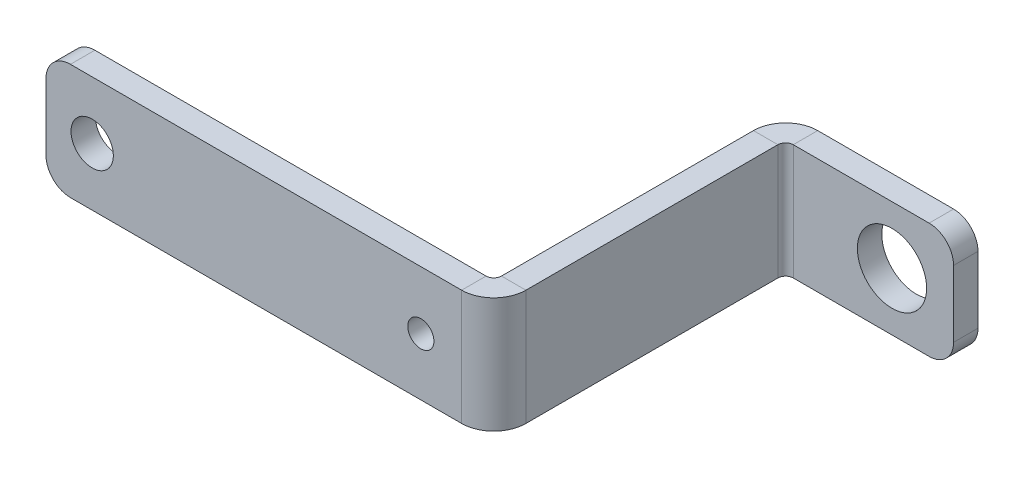
ISO-10303-21;
HEADER;
FILE_DESCRIPTION(('STEP AP214'),'2;1');
FILE_NAME('part.step','',(''),(''),'','','');
FILE_SCHEMA(('AUTOMOTIVE_DESIGN { 1 0 10303 214 1 1 1 1 }'));
ENDSEC;
DATA;
#1=APPLICATION_CONTEXT('core data for automotive mechanical design processes');
#2=APPLICATION_PROTOCOL_DEFINITION('international standard','automotive_design',2000,#1);
#3=PRODUCT_CONTEXT('',#1,'mechanical');
#4=PRODUCT('Part','Part','',(#3));
#5=PRODUCT_RELATED_PRODUCT_CATEGORY('part','',(#4));
#6=PRODUCT_DEFINITION_FORMATION('','',#4);
#7=PRODUCT_DEFINITION_CONTEXT('part definition',#1,'design');
#8=PRODUCT_DEFINITION('design','',#6,#7);
#9=PRODUCT_DEFINITION_SHAPE('','',#8);
#10=(LENGTH_UNIT() NAMED_UNIT(*) SI_UNIT(.MILLI.,.METRE.));
#11=(NAMED_UNIT(*) PLANE_ANGLE_UNIT() SI_UNIT($,.RADIAN.));
#12=(NAMED_UNIT(*) SI_UNIT($,.STERADIAN.) SOLID_ANGLE_UNIT());
#13=UNCERTAINTY_MEASURE_WITH_UNIT(LENGTH_MEASURE(1.E-05),#10,'distance_accuracy_value','');
#14=(GEOMETRIC_REPRESENTATION_CONTEXT(3) GLOBAL_UNCERTAINTY_ASSIGNED_CONTEXT((#13)) GLOBAL_UNIT_ASSIGNED_CONTEXT((#10,
#11,#12)) REPRESENTATION_CONTEXT('',''));
#15=CARTESIAN_POINT('',(0.,0.,0.));
#16=DIRECTION('',(0.,0.,1.));
#17=DIRECTION('',(1.,0.,0.));
#18=AXIS2_PLACEMENT_3D('',#15,#16,#17);
#19=CARTESIAN_POINT('',(73.9092845848611,306.128054741671,3.175));
#20=DIRECTION('',(1.,0.,0.));
#21=DIRECTION('',(0.,0.,-1.));
#22=AXIS2_PLACEMENT_3D('',#19,#20,#21);
#23=PLANE('',#22);
#24=DIRECTION('',(0.,-1.,0.));
#25=VECTOR('',#24,1.);
#26=CARTESIAN_POINT('',(73.9092845848611,306.128054741671,3.175));
#27=LINE('',#26,#25);
#28=CARTESIAN_POINT('',(73.9092845848611,317.953054741671,3.175));
#29=VERTEX_POINT('',#28);
#30=CARTESIAN_POINT('',(73.9092845848611,309.303054741671,3.175));
#31=VERTEX_POINT('',#30);
#32=EDGE_CURVE('E302',#29,#31,#27,.T.);
#33=ORIENTED_EDGE('',*,*,#32,.F.);
#34=DIRECTION('',(0.,0.,-1.));
#35=VECTOR('',#34,1.);
#36=CARTESIAN_POINT('',(73.9092845848611,317.953054741671,3.175));
#37=LINE('',#36,#35);
#38=CARTESIAN_POINT('',(73.9092845848611,317.953054741671,0.));
#39=VERTEX_POINT('',#38);
#40=EDGE_CURVE('E342',#29,#39,#37,.T.);
#41=ORIENTED_EDGE('',*,*,#40,.T.);
#42=DIRECTION('',(0.,-1.,0.));
#43=VECTOR('',#42,1.);
#44=CARTESIAN_POINT('',(73.9092845848611,306.128054741671,0.));
#45=LINE('',#44,#43);
#46=CARTESIAN_POINT('',(73.9092845848611,309.303054741671,0.));
#47=VERTEX_POINT('',#46);
#48=EDGE_CURVE('E291',#39,#47,#45,.T.);
#49=ORIENTED_EDGE('',*,*,#48,.T.);
#50=DIRECTION('',(0.,0.,-1.));
#51=VECTOR('',#50,1.);
#52=CARTESIAN_POINT('',(73.9092845848611,309.303054741671,3.175));
#53=LINE('',#52,#51);
#54=EDGE_CURVE('E340',#47,#31,#53,.F.);
#55=ORIENTED_EDGE('',*,*,#54,.T.);
#56=EDGE_LOOP('',(#33,#41,#49,#55));
#57=FACE_BOUND('',#56,.T.);
#58=ADVANCED_FACE('F81',(#57),#23,.F.);
#59=CARTESIAN_POINT('',(79.9092845848611,306.128054741671,3.175));
#60=DIRECTION('',(0.,1.,0.));
#61=DIRECTION('',(-1.,0.,0.));
#62=AXIS2_PLACEMENT_3D('',#59,#60,#61);
#63=PLANE('',#62);
#64=DIRECTION('',(1.,0.,0.));
#65=VECTOR('',#64,1.);
#66=CARTESIAN_POINT('',(79.9092845848611,306.128054741671,3.175));
#67=LINE('',#66,#65);
#68=CARTESIAN_POINT('',(77.0842845848611,306.128054741671,3.175));
#69=VERTEX_POINT('',#68);
#70=CARTESIAN_POINT('',(127.909284584861,306.128054741671,3.175));
#71=VERTEX_POINT('',#70);
#72=EDGE_CURVE('E305',#69,#71,#67,.T.);
#73=ORIENTED_EDGE('',*,*,#72,.F.);
#74=DIRECTION('',(0.,0.,-1.));
#75=VECTOR('',#74,1.);
#76=CARTESIAN_POINT('',(77.0842845848611,306.128054741671,3.175));
#77=LINE('',#76,#75);
#78=CARTESIAN_POINT('',(77.0842845848611,306.128054741671,0.));
#79=VERTEX_POINT('',#78);
#80=EDGE_CURVE('E13',#69,#79,#77,.T.);
#81=ORIENTED_EDGE('',*,*,#80,.T.);
#82=DIRECTION('',(1.,0.,0.));
#83=VECTOR('',#82,1.);
#84=CARTESIAN_POINT('',(79.9092845848611,306.128054741671,0.));
#85=LINE('',#84,#83);
#86=CARTESIAN_POINT('',(127.909284584861,306.128054741671,0.));
#87=VERTEX_POINT('',#86);
#88=EDGE_CURVE('E313',#79,#87,#85,.T.);
#89=ORIENTED_EDGE('',*,*,#88,.T.);
#90=DIRECTION('',(0.,0.,-1.));
#91=VECTOR('',#90,1.);
#92=CARTESIAN_POINT('',(127.909284584861,306.128054741671,3.175));
#93=LINE('',#92,#91);
#94=EDGE_CURVE('E320',#71,#87,#93,.T.);
#95=ORIENTED_EDGE('',*,*,#94,.F.);
#96=EDGE_LOOP('',(#73,#81,#89,#95));
#97=FACE_BOUND('',#96,.T.);
#98=ADVANCED_FACE('F433',(#97),#63,.F.);
#99=CARTESIAN_POINT('',(127.909284584861,321.128054741671,3.175));
#100=DIRECTION('',(0.,-1.,0.));
#101=DIRECTION('',(0.,0.,-1.));
#102=AXIS2_PLACEMENT_3D('',#99,#100,#101);
#103=PLANE('',#102);
#104=DIRECTION('',(-1.,0.,0.));
#105=VECTOR('',#104,1.);
#106=CARTESIAN_POINT('',(127.909284584861,321.128054741671,0.));
#107=LINE('',#106,#105);
#108=CARTESIAN_POINT('',(127.909284584861,321.12805474167,0.));
#109=VERTEX_POINT('',#108);
#110=CARTESIAN_POINT('',(77.0842845848611,321.128054741671,0.));
#111=VERTEX_POINT('',#110);
#112=EDGE_CURVE('E303',#109,#111,#107,.T.);
#113=ORIENTED_EDGE('',*,*,#112,.T.);
#114=DIRECTION('',(0.,0.,-1.));
#115=VECTOR('',#114,1.);
#116=CARTESIAN_POINT('',(77.0842845848611,321.128054741671,3.175));
#117=LINE('',#116,#115);
#118=CARTESIAN_POINT('',(77.0842845848611,321.128054741671,3.175));
#119=VERTEX_POINT('',#118);
#120=EDGE_CURVE('E105',#111,#119,#117,.F.);
#121=ORIENTED_EDGE('',*,*,#120,.T.);
#122=DIRECTION('',(-1.,0.,0.));
#123=VECTOR('',#122,1.);
#124=CARTESIAN_POINT('',(73.9092845848611,321.128054741671,3.175));
#125=LINE('',#124,#123);
#126=CARTESIAN_POINT('',(127.909284584861,321.128054741671,3.175));
#127=VERTEX_POINT('',#126);
#128=EDGE_CURVE('E300',#127,#119,#125,.T.);
#129=ORIENTED_EDGE('',*,*,#128,.F.);
#130=DIRECTION('',(0.,0.,-1.));
#131=VECTOR('',#130,1.);
#132=CARTESIAN_POINT('',(127.909284584861,321.128054741671,3.175));
#133=LINE('',#132,#131);
#134=EDGE_CURVE('E310',#127,#109,#133,.T.);
#135=ORIENTED_EDGE('',*,*,#134,.T.);
#136=EDGE_LOOP('',(#113,#121,#129,#135));
#137=FACE_BOUND('',#136,.T.);
#138=ADVANCED_FACE('F364',(#137),#103,.F.);
#139=CARTESIAN_POINT('',(0.,0.,3.175));
#140=DIRECTION('',(0.,0.,1.));
#141=DIRECTION('',(1.,0.,0.));
#142=AXIS2_PLACEMENT_3D('',#139,#140,#141);
#143=PLANE('',#142);
#144=CARTESIAN_POINT('',(122.60928458487,313.578054741671,3.175));
#145=DIRECTION('',(0.,0.,1.));
#146=DIRECTION('',(1.,0.,0.));
#147=AXIS2_PLACEMENT_3D('',#144,#145,#146);
#148=CIRCLE('',#147,1.69999999999999);
#149=CARTESIAN_POINT('',(124.30928458487,313.578054741671,3.175));
#150=VERTEX_POINT('',#149);
#151=EDGE_CURVE('E414',#150,#150,#148,.T.);
#152=ORIENTED_EDGE('',*,*,#151,.F.);
#153=EDGE_LOOP('',(#152));
#154=FACE_BOUND('',#153,.T.);
#155=CARTESIAN_POINT('',(79.9092845848612,313.628054741671,3.175));
#156=DIRECTION('',(0.,0.,1.));
#157=DIRECTION('',(1.,0.,0.));
#158=AXIS2_PLACEMENT_3D('',#155,#156,#157);
#159=CIRCLE('',#158,2.75);
#160=CARTESIAN_POINT('',(82.6592845848612,313.628054741671,3.175));
#161=VERTEX_POINT('',#160);
#162=EDGE_CURVE('E405',#161,#161,#159,.T.);
#163=ORIENTED_EDGE('',*,*,#162,.F.);
#164=EDGE_LOOP('',(#163));
#165=FACE_BOUND('',#164,.T.);
#166=ORIENTED_EDGE('',*,*,#128,.T.);
#167=CARTESIAN_POINT('',(77.0842845848611,317.953054741671,3.175));
#168=DIRECTION('',(0.,0.,1.));
#169=DIRECTION('',(1.,0.,0.));
#170=AXIS2_PLACEMENT_3D('',#167,#168,#169);
#171=CIRCLE('',#170,3.175);
#172=EDGE_CURVE('E90',#119,#29,#171,.T.);
#173=ORIENTED_EDGE('',*,*,#172,.T.);
#174=ORIENTED_EDGE('',*,*,#32,.T.);
#175=CARTESIAN_POINT('',(77.0842845848611,309.303054741671,3.175));
#176=DIRECTION('',(0.,0.,1.));
#177=DIRECTION('',(1.,0.,0.));
#178=AXIS2_PLACEMENT_3D('',#175,#176,#177);
#179=CIRCLE('',#178,3.175);
#180=EDGE_CURVE('E97',#31,#69,#179,.T.);
#181=ORIENTED_EDGE('',*,*,#180,.T.);
#182=ORIENTED_EDGE('',*,*,#72,.T.);
#183=DIRECTION('',(0.,1.,0.));
#184=VECTOR('',#183,1.);
#185=CARTESIAN_POINT('',(127.909284584861,306.128054741671,3.175));
#186=LINE('',#185,#184);
#187=EDGE_CURVE('E307',#71,#127,#186,.T.);
#188=ORIENTED_EDGE('',*,*,#187,.T.);
#189=EDGE_LOOP('',(#166,#173,#174,#181,#182,#188));
#190=FACE_BOUND('',#189,.T.);
#191=ADVANCED_FACE('F353',(#154,#165,#190),#143,.T.);
#192=CARTESIAN_POINT('',(0.,0.,0.));
#193=DIRECTION('',(0.,0.,1.));
#194=DIRECTION('',(1.,0.,0.));
#195=AXIS2_PLACEMENT_3D('',#192,#193,#194);
#196=PLANE('',#195);
#197=CARTESIAN_POINT('',(122.60928458487,313.578054741671,0.));
#198=DIRECTION('',(0.,0.,1.));
#199=DIRECTION('',(1.,0.,0.));
#200=AXIS2_PLACEMENT_3D('',#197,#198,#199);
#201=CIRCLE('',#200,1.69999999999999);
#202=CARTESIAN_POINT('',(124.30928458487,313.578054741671,0.));
#203=VERTEX_POINT('',#202);
#204=EDGE_CURVE('E85',#203,#203,#201,.T.);
#205=ORIENTED_EDGE('',*,*,#204,.T.);
#206=EDGE_LOOP('',(#205));
#207=FACE_BOUND('',#206,.T.);
#208=CARTESIAN_POINT('',(79.9092845848612,313.628054741671,0.));
#209=DIRECTION('',(0.,0.,1.));
#210=DIRECTION('',(1.,0.,0.));
#211=AXIS2_PLACEMENT_3D('',#208,#209,#210);
#212=CIRCLE('',#211,2.75);
#213=CARTESIAN_POINT('',(82.6592845848612,313.628054741671,0.));
#214=VERTEX_POINT('',#213);
#215=EDGE_CURVE('E253',#214,#214,#212,.T.);
#216=ORIENTED_EDGE('',*,*,#215,.T.);
#217=EDGE_LOOP('',(#216));
#218=FACE_BOUND('',#217,.T.);
#219=ORIENTED_EDGE('',*,*,#48,.F.);
#220=CARTESIAN_POINT('',(77.0842845848611,317.953054741671,0.));
#221=DIRECTION('',(0.,0.,1.));
#222=DIRECTION('',(1.,0.,0.));
#223=AXIS2_PLACEMENT_3D('',#220,#221,#222);
#224=CIRCLE('',#223,3.175);
#225=EDGE_CURVE('E347',#39,#111,#224,.F.);
#226=ORIENTED_EDGE('',*,*,#225,.T.);
#227=ORIENTED_EDGE('',*,*,#112,.F.);
#228=DIRECTION('',(0.,1.,0.));
#229=VECTOR('',#228,1.);
#230=CARTESIAN_POINT('',(127.909284584861,306.128054741671,0.));
#231=LINE('',#230,#229);
#232=EDGE_CURVE('E315',#87,#109,#231,.T.);
#233=ORIENTED_EDGE('',*,*,#232,.F.);
#234=ORIENTED_EDGE('',*,*,#88,.F.);
#235=CARTESIAN_POINT('',(77.0842845848611,309.303054741671,0.));
#236=DIRECTION('',(0.,0.,1.));
#237=DIRECTION('',(1.,0.,0.));
#238=AXIS2_PLACEMENT_3D('',#235,#236,#237);
#239=CIRCLE('',#238,3.175);
#240=EDGE_CURVE('E345',#79,#47,#239,.F.);
#241=ORIENTED_EDGE('',*,*,#240,.T.);
#242=EDGE_LOOP('',(#219,#226,#227,#233,#234,#241));
#243=FACE_BOUND('',#242,.T.);
#244=ADVANCED_FACE('F362',(#207,#218,#243),#196,.F.);
#245=CARTESIAN_POINT('',(127.909284584861,321.12805474167,-1.));
#246=DIRECTION('',(0.,1.,0.));
#247=DIRECTION('',(0.,0.,1.));
#248=AXIS2_PLACEMENT_3D('',#245,#246,#247);
#249=PLANE('',#248);
#250=DIRECTION('',(-1.,0.,0.));
#251=VECTOR('',#250,1.);
#252=CARTESIAN_POINT('',(132.084284584861,321.128054741671,-0.99999999999999));
#253=LINE('',#252,#251);
#254=CARTESIAN_POINT('',(128.909284584861,321.12805474167,-1.));
#255=VERTEX_POINT('',#254);
#256=CARTESIAN_POINT('',(132.084284584861,321.12805474167,-0.999999999999991));
#257=VERTEX_POINT('',#256);
#258=EDGE_CURVE('E254',#255,#257,#253,.F.);
#259=ORIENTED_EDGE('',*,*,#258,.F.);
#260=CARTESIAN_POINT('',(127.909284584861,321.12805474167,-1.));
#261=DIRECTION('',(0.,-1.,0.));
#262=DIRECTION('',(0.,0.,-1.));
#263=AXIS2_PLACEMENT_3D('',#260,#261,#262);
#264=CIRCLE('',#263,1.);
#265=EDGE_CURVE('E295',#109,#255,#264,.F.);
#266=ORIENTED_EDGE('',*,*,#265,.F.);
#267=ORIENTED_EDGE('',*,*,#134,.F.);
#268=CARTESIAN_POINT('',(127.909284584861,321.12805474167,-1.));
#269=DIRECTION('',(0.,-1.,0.));
#270=DIRECTION('',(0.,0.,-1.));
#271=AXIS2_PLACEMENT_3D('',#268,#269,#270);
#272=CIRCLE('',#271,4.175);
#273=EDGE_CURVE('E288',#127,#257,#272,.F.);
#274=ORIENTED_EDGE('',*,*,#273,.T.);
#275=EDGE_LOOP('',(#259,#266,#267,#274));
#276=FACE_BOUND('',#275,.T.);
#277=ADVANCED_FACE('F368',(#276),#249,.T.);
#278=CARTESIAN_POINT('',(127.909284584861,306.128054741671,-1.));
#279=DIRECTION('',(0.,1.,0.));
#280=DIRECTION('',(0.,0.,1.));
#281=AXIS2_PLACEMENT_3D('',#278,#279,#280);
#282=PLANE('',#281);
#283=CARTESIAN_POINT('',(127.909284584861,306.128054741671,-1.));
#284=DIRECTION('',(0.,-1.,0.));
#285=DIRECTION('',(0.,0.,-1.));
#286=AXIS2_PLACEMENT_3D('',#283,#284,#285);
#287=CIRCLE('',#286,1.);
#288=CARTESIAN_POINT('',(128.909284584861,306.128054741671,-1.));
#289=VERTEX_POINT('',#288);
#290=EDGE_CURVE('E262',#289,#87,#287,.T.);
#291=ORIENTED_EDGE('',*,*,#290,.F.);
#292=DIRECTION('',(-1.,0.,0.));
#293=VECTOR('',#292,1.);
#294=CARTESIAN_POINT('',(128.909284584861,306.128054741671,-1.));
#295=LINE('',#294,#293);
#296=CARTESIAN_POINT('',(132.084284584861,306.128054741671,-0.99999999999999));
#297=VERTEX_POINT('',#296);
#298=EDGE_CURVE('E281',#289,#297,#295,.F.);
#299=ORIENTED_EDGE('',*,*,#298,.T.);
#300=CARTESIAN_POINT('',(127.909284584861,306.128054741671,-1.));
#301=DIRECTION('',(0.,-1.,0.));
#302=DIRECTION('',(0.,0.,-1.));
#303=AXIS2_PLACEMENT_3D('',#300,#301,#302);
#304=CIRCLE('',#303,4.175);
#305=EDGE_CURVE('E292',#297,#71,#304,.T.);
#306=ORIENTED_EDGE('',*,*,#305,.T.);
#307=ORIENTED_EDGE('',*,*,#94,.T.);
#308=EDGE_LOOP('',(#291,#299,#306,#307));
#309=FACE_BOUND('',#308,.T.);
#310=ADVANCED_FACE('F483',(#309),#282,.F.);
#311=CARTESIAN_POINT('',(127.909284584861,306.128054741671,-1.));
#312=DIRECTION('',(0.,-1.,0.));
#313=DIRECTION('',(1.,0.,0.));
#314=AXIS2_PLACEMENT_3D('',#311,#312,#313);
#315=CYLINDRICAL_SURFACE('',#314,4.175);
#316=ORIENTED_EDGE('',*,*,#187,.F.);
#317=ORIENTED_EDGE('',*,*,#305,.F.);
#318=DIRECTION('',(0.,-1.,0.));
#319=VECTOR('',#318,1.);
#320=CARTESIAN_POINT('',(132.084284584861,321.128054741671,-0.99999999999999));
#321=LINE('',#320,#319);
#322=EDGE_CURVE('E279',#297,#257,#321,.F.);
#323=ORIENTED_EDGE('',*,*,#322,.T.);
#324=ORIENTED_EDGE('',*,*,#273,.F.);
#325=EDGE_LOOP('',(#316,#317,#323,#324));
#326=FACE_BOUND('',#325,.T.);
#327=ADVANCED_FACE('F493',(#326),#315,.T.);
#328=CARTESIAN_POINT('',(127.909284584861,306.128054741671,-1.));
#329=DIRECTION('',(0.,-1.,0.));
#330=DIRECTION('',(1.,0.,0.));
#331=AXIS2_PLACEMENT_3D('',#328,#329,#330);
#332=CYLINDRICAL_SURFACE('',#331,1.);
#333=ORIENTED_EDGE('',*,*,#232,.T.);
#334=ORIENTED_EDGE('',*,*,#265,.T.);
#335=DIRECTION('',(0.,-1.,0.));
#336=VECTOR('',#335,1.);
#337=CARTESIAN_POINT('',(128.909284584861,321.128054741671,-1.));
#338=LINE('',#337,#336);
#339=EDGE_CURVE('E284',#255,#289,#338,.T.);
#340=ORIENTED_EDGE('',*,*,#339,.T.);
#341=ORIENTED_EDGE('',*,*,#290,.T.);
#342=EDGE_LOOP('',(#333,#334,#340,#341));
#343=FACE_BOUND('',#342,.T.);
#344=ADVANCED_FACE('F371',(#343),#332,.F.);
#345=CARTESIAN_POINT('',(132.084284584861,306.128054741671,-33.738));
#346=DIRECTION('',(0.,1.,0.));
#347=DIRECTION('',(0.,0.,1.));
#348=AXIS2_PLACEMENT_3D('',#345,#346,#347);
#349=PLANE('',#348);
#350=ORIENTED_EDGE('',*,*,#298,.F.);
#351=DIRECTION('',(0.,0.,1.));
#352=VECTOR('',#351,1.);
#353=CARTESIAN_POINT('',(128.909284584861,306.128054741671,-33.738));
#354=LINE('',#353,#352);
#355=CARTESIAN_POINT('',(128.909284584861,306.128054741671,-33.738));
#356=VERTEX_POINT('',#355);
#357=EDGE_CURVE('E277',#289,#356,#354,.F.);
#358=ORIENTED_EDGE('',*,*,#357,.T.);
#359=DIRECTION('',(-1.,0.,0.));
#360=VECTOR('',#359,1.);
#361=CARTESIAN_POINT('',(132.084284584861,306.128054741671,-33.738));
#362=LINE('',#361,#360);
#363=CARTESIAN_POINT('',(132.084284584861,306.128054741671,-33.738));
#364=VERTEX_POINT('',#363);
#365=EDGE_CURVE('E259',#364,#356,#362,.T.);
#366=ORIENTED_EDGE('',*,*,#365,.F.);
#367=DIRECTION('',(0.,0.,-1.));
#368=VECTOR('',#367,1.);
#369=CARTESIAN_POINT('',(132.084284584861,306.128054741671,4.31999060487309E-13));
#370=LINE('',#369,#368);
#371=EDGE_CURVE('E271',#297,#364,#370,.T.);
#372=ORIENTED_EDGE('',*,*,#371,.F.);
#373=EDGE_LOOP('',(#350,#358,#366,#372));
#374=FACE_BOUND('',#373,.T.);
#375=ADVANCED_FACE('F514',(#374),#349,.F.);
#376=CARTESIAN_POINT('',(132.084284584861,321.128054741671,0.));
#377=DIRECTION('',(0.,-1.,0.));
#378=DIRECTION('',(0.,0.,-1.));
#379=AXIS2_PLACEMENT_3D('',#376,#377,#378);
#380=PLANE('',#379);
#381=ORIENTED_EDGE('',*,*,#258,.T.);
#382=DIRECTION('',(0.,0.,1.));
#383=VECTOR('',#382,1.);
#384=CARTESIAN_POINT('',(132.084284584861,321.128054741671,4.31999060487309E-13));
#385=LINE('',#384,#383);
#386=CARTESIAN_POINT('',(132.084284584861,321.128054741671,-33.738));
#387=VERTEX_POINT('',#386);
#388=EDGE_CURVE('E266',#387,#257,#385,.T.);
#389=ORIENTED_EDGE('',*,*,#388,.F.);
#390=DIRECTION('',(-1.,0.,0.));
#391=VECTOR('',#390,1.);
#392=CARTESIAN_POINT('',(132.084284584861,321.128054741671,-33.738));
#393=LINE('',#392,#391);
#394=CARTESIAN_POINT('',(128.909284584861,321.128054741671,-33.738));
#395=VERTEX_POINT('',#394);
#396=EDGE_CURVE('E263',#387,#395,#393,.T.);
#397=ORIENTED_EDGE('',*,*,#396,.T.);
#398=DIRECTION('',(0.,0.,-1.));
#399=VECTOR('',#398,1.);
#400=CARTESIAN_POINT('',(128.909284584861,321.128054741671,0.));
#401=LINE('',#400,#399);
#402=EDGE_CURVE('E273',#395,#255,#401,.F.);
#403=ORIENTED_EDGE('',*,*,#402,.T.);
#404=EDGE_LOOP('',(#381,#389,#397,#403));
#405=FACE_BOUND('',#404,.T.);
#406=ADVANCED_FACE('F377',(#405),#380,.F.);
#407=CARTESIAN_POINT('',(132.084284584861,0.,4.31999060487309E-13));
#408=DIRECTION('',(-1.,0.,0.));
#409=DIRECTION('',(0.,0.,1.));
#410=AXIS2_PLACEMENT_3D('',#407,#408,#409);
#411=PLANE('',#410);
#412=ORIENTED_EDGE('',*,*,#322,.F.);
#413=ORIENTED_EDGE('',*,*,#371,.T.);
#414=DIRECTION('',(0.,1.,0.));
#415=VECTOR('',#414,1.);
#416=CARTESIAN_POINT('',(132.084284584861,0.,-33.738));
#417=LINE('',#416,#415);
#418=EDGE_CURVE('E269',#364,#387,#417,.T.);
#419=ORIENTED_EDGE('',*,*,#418,.T.);
#420=ORIENTED_EDGE('',*,*,#388,.T.);
#421=EDGE_LOOP('',(#412,#413,#419,#420));
#422=FACE_BOUND('',#421,.T.);
#423=ADVANCED_FACE('F534',(#422),#411,.F.);
#424=CARTESIAN_POINT('',(128.909284584861,0.,4.20913607236482E-13));
#425=DIRECTION('',(-1.,0.,0.));
#426=DIRECTION('',(0.,0.,1.));
#427=AXIS2_PLACEMENT_3D('',#424,#425,#426);
#428=PLANE('',#427);
#429=ORIENTED_EDGE('',*,*,#357,.F.);
#430=ORIENTED_EDGE('',*,*,#339,.F.);
#431=ORIENTED_EDGE('',*,*,#402,.F.);
#432=DIRECTION('',(0.,-1.,0.));
#433=VECTOR('',#432,1.);
#434=CARTESIAN_POINT('',(128.909284584861,321.128054741671,-33.738));
#435=LINE('',#434,#433);
#436=EDGE_CURVE('E207',#356,#395,#435,.F.);
#437=ORIENTED_EDGE('',*,*,#436,.F.);
#438=EDGE_LOOP('',(#429,#430,#431,#437));
#439=FACE_BOUND('',#438,.T.);
#440=ADVANCED_FACE('F375',(#439),#428,.T.);
#441=CARTESIAN_POINT('',(133.084284584861,306.128054741671,-33.738));
#442=DIRECTION('',(0.,-1.,0.));
#443=DIRECTION('',(0.,0.,-1.));
#444=AXIS2_PLACEMENT_3D('',#441,#442,#443);
#445=PLANE('',#444);
#446=DIRECTION('',(0.,0.,1.));
#447=VECTOR('',#446,1.);
#448=CARTESIAN_POINT('',(133.084284584861,306.128054741671,-37.913));
#449=LINE('',#448,#447);
#450=CARTESIAN_POINT('',(133.084284584861,306.128054741671,-34.738));
#451=VERTEX_POINT('',#450);
#452=CARTESIAN_POINT('',(133.084284584861,306.128054741671,-37.913));
#453=VERTEX_POINT('',#452);
#454=EDGE_CURVE('E250',#451,#453,#449,.F.);
#455=ORIENTED_EDGE('',*,*,#454,.F.);
#456=CARTESIAN_POINT('',(133.084284584861,306.128054741671,-33.738));
#457=DIRECTION('',(0.,1.,0.));
#458=DIRECTION('',(0.,0.,1.));
#459=AXIS2_PLACEMENT_3D('',#456,#457,#458);
#460=CIRCLE('',#459,1.);
#461=EDGE_CURVE('E211',#364,#451,#460,.F.);
#462=ORIENTED_EDGE('',*,*,#461,.F.);
#463=ORIENTED_EDGE('',*,*,#365,.T.);
#464=CARTESIAN_POINT('',(133.084284584861,306.128054741671,-33.738));
#465=DIRECTION('',(0.,1.,0.));
#466=DIRECTION('',(0.,0.,1.));
#467=AXIS2_PLACEMENT_3D('',#464,#465,#466);
#468=CIRCLE('',#467,4.175);
#469=EDGE_CURVE('E210',#356,#453,#468,.F.);
#470=ORIENTED_EDGE('',*,*,#469,.T.);
#471=EDGE_LOOP('',(#455,#462,#463,#470));
#472=FACE_BOUND('',#471,.T.);
#473=ADVANCED_FACE('F554',(#472),#445,.T.);
#474=CARTESIAN_POINT('',(133.084284584861,321.128054741671,-33.738));
#475=DIRECTION('',(0.,-1.,0.));
#476=DIRECTION('',(0.,0.,-1.));
#477=AXIS2_PLACEMENT_3D('',#474,#475,#476);
#478=PLANE('',#477);
#479=CARTESIAN_POINT('',(133.084284584861,321.128054741671,-33.738));
#480=DIRECTION('',(0.,1.,0.));
#481=DIRECTION('',(0.,0.,1.));
#482=AXIS2_PLACEMENT_3D('',#479,#480,#481);
#483=CIRCLE('',#482,1.);
#484=CARTESIAN_POINT('',(133.084284584861,321.128054741671,-34.738));
#485=VERTEX_POINT('',#484);
#486=EDGE_CURVE('E218',#485,#387,#483,.T.);
#487=ORIENTED_EDGE('',*,*,#486,.F.);
#488=DIRECTION('',(0.,0.,1.));
#489=VECTOR('',#488,1.);
#490=CARTESIAN_POINT('',(133.084284584861,321.128054741671,-34.738));
#491=LINE('',#490,#489);
#492=CARTESIAN_POINT('',(133.084284584861,321.128054741671,-37.913));
#493=VERTEX_POINT('',#492);
#494=EDGE_CURVE('E215',#485,#493,#491,.F.);
#495=ORIENTED_EDGE('',*,*,#494,.T.);
#496=CARTESIAN_POINT('',(133.084284584861,321.128054741671,-33.738));
#497=DIRECTION('',(0.,1.,0.));
#498=DIRECTION('',(0.,0.,1.));
#499=AXIS2_PLACEMENT_3D('',#496,#497,#498);
#500=CIRCLE('',#499,4.175);
#501=EDGE_CURVE('E199',#493,#395,#500,.T.);
#502=ORIENTED_EDGE('',*,*,#501,.T.);
#503=ORIENTED_EDGE('',*,*,#396,.F.);
#504=EDGE_LOOP('',(#487,#495,#502,#503));
#505=FACE_BOUND('',#504,.T.);
#506=ADVANCED_FACE('F216',(#505),#478,.F.);
#507=CARTESIAN_POINT('',(133.084284584861,321.128054741671,-33.738));
#508=DIRECTION('',(0.,1.,0.));
#509=DIRECTION('',(0.,0.,-1.));
#510=AXIS2_PLACEMENT_3D('',#507,#508,#509);
#511=CYLINDRICAL_SURFACE('',#510,4.175);
#512=ORIENTED_EDGE('',*,*,#436,.T.);
#513=ORIENTED_EDGE('',*,*,#501,.F.);
#514=DIRECTION('',(0.,1.,0.));
#515=VECTOR('',#514,1.);
#516=CARTESIAN_POINT('',(133.084284584861,306.128054741671,-37.913));
#517=LINE('',#516,#515);
#518=EDGE_CURVE('E204',#493,#453,#517,.F.);
#519=ORIENTED_EDGE('',*,*,#518,.T.);
#520=ORIENTED_EDGE('',*,*,#469,.F.);
#521=EDGE_LOOP('',(#512,#513,#519,#520));
#522=FACE_BOUND('',#521,.T.);
#523=ADVANCED_FACE('F201',(#522),#511,.T.);
#524=CARTESIAN_POINT('',(133.084284584861,321.128054741671,-33.738));
#525=DIRECTION('',(0.,1.,0.));
#526=DIRECTION('',(0.,0.,-1.));
#527=AXIS2_PLACEMENT_3D('',#524,#525,#526);
#528=CYLINDRICAL_SURFACE('',#527,1.);
#529=ORIENTED_EDGE('',*,*,#418,.F.);
#530=ORIENTED_EDGE('',*,*,#461,.T.);
#531=DIRECTION('',(0.,1.,0.));
#532=VECTOR('',#531,1.);
#533=CARTESIAN_POINT('',(133.084284584861,306.128054741671,-34.738));
#534=LINE('',#533,#532);
#535=EDGE_CURVE('E223',#451,#485,#534,.T.);
#536=ORIENTED_EDGE('',*,*,#535,.T.);
#537=ORIENTED_EDGE('',*,*,#486,.T.);
#538=EDGE_LOOP('',(#529,#530,#536,#537));
#539=FACE_BOUND('',#538,.T.);
#540=ADVANCED_FACE('F381',(#539),#528,.F.);
#541=CARTESIAN_POINT('',(153.909284584861,321.128054741671,-37.913));
#542=DIRECTION('',(0.,-1.,0.));
#543=DIRECTION('',(0.,0.,-1.));
#544=AXIS2_PLACEMENT_3D('',#541,#542,#543);
#545=PLANE('',#544);
#546=DIRECTION('',(-1.,0.,0.));
#547=VECTOR('',#546,1.);
#548=CARTESIAN_POINT('',(153.909284584861,321.128054741671,-34.738));
#549=LINE('',#548,#547);
#550=CARTESIAN_POINT('',(150.734284584861,321.128054741671,-34.738));
#551=VERTEX_POINT('',#550);
#552=EDGE_CURVE('E232',#485,#551,#549,.F.);
#553=ORIENTED_EDGE('',*,*,#552,.T.);
#554=DIRECTION('',(0.,0.,1.));
#555=VECTOR('',#554,1.);
#556=CARTESIAN_POINT('',(150.734284584861,321.128054741671,-37.913));
#557=LINE('',#556,#555);
#558=CARTESIAN_POINT('',(150.734284584861,321.128054741671,-37.913));
#559=VERTEX_POINT('',#558);
#560=EDGE_CURVE('E236',#551,#559,#557,.F.);
#561=ORIENTED_EDGE('',*,*,#560,.T.);
#562=DIRECTION('',(1.,0.,0.));
#563=VECTOR('',#562,1.);
#564=CARTESIAN_POINT('',(0.,321.128054741671,-37.9129999999999));
#565=LINE('',#564,#563);
#566=EDGE_CURVE('E228',#493,#559,#565,.T.);
#567=ORIENTED_EDGE('',*,*,#566,.F.);
#568=ORIENTED_EDGE('',*,*,#494,.F.);
#569=EDGE_LOOP('',(#553,#561,#567,#568));
#570=FACE_BOUND('',#569,.T.);
#571=ADVANCED_FACE('F234',(#570),#545,.F.);
#572=CARTESIAN_POINT('',(132.084284584861,306.128054741671,-37.913));
#573=DIRECTION('',(0.,1.,0.));
#574=DIRECTION('',(0.,0.,1.));
#575=AXIS2_PLACEMENT_3D('',#572,#573,#574);
#576=PLANE('',#575);
#577=DIRECTION('',(-1.,0.,0.));
#578=VECTOR('',#577,1.);
#579=CARTESIAN_POINT('',(0.,306.128054741671,-37.9129999999999));
#580=LINE('',#579,#578);
#581=CARTESIAN_POINT('',(150.734284584861,306.128054741671,-37.913));
#582=VERTEX_POINT('',#581);
#583=EDGE_CURVE('E231',#582,#453,#580,.T.);
#584=ORIENTED_EDGE('',*,*,#583,.F.);
#585=DIRECTION('',(0.,0.,1.));
#586=VECTOR('',#585,1.);
#587=CARTESIAN_POINT('',(150.734284584861,306.128054741671,-37.913));
#588=LINE('',#587,#586);
#589=CARTESIAN_POINT('',(150.734284584861,306.128054741671,-34.738));
#590=VERTEX_POINT('',#589);
#591=EDGE_CURVE('E337',#582,#590,#588,.T.);
#592=ORIENTED_EDGE('',*,*,#591,.T.);
#593=DIRECTION('',(1.,0.,0.));
#594=VECTOR('',#593,1.);
#595=CARTESIAN_POINT('',(132.084284584861,306.128054741671,-34.738));
#596=LINE('',#595,#594);
#597=EDGE_CURVE('E238',#590,#451,#596,.F.);
#598=ORIENTED_EDGE('',*,*,#597,.T.);
#599=ORIENTED_EDGE('',*,*,#454,.T.);
#600=EDGE_LOOP('',(#584,#592,#598,#599));
#601=FACE_BOUND('',#600,.T.);
#602=ADVANCED_FACE('F400',(#601),#576,.F.);
#603=CARTESIAN_POINT('',(0.,0.,-37.9129999999999));
#604=DIRECTION('',(0.,0.,1.));
#605=DIRECTION('',(1.,0.,0.));
#606=AXIS2_PLACEMENT_3D('',#603,#604,#605);
#607=PLANE('',#606);
#608=CARTESIAN_POINT('',(145.909284584861,313.628054741671,-37.913));
#609=DIRECTION('',(0.,0.,1.));
#610=DIRECTION('',(1.,0.,0.));
#611=AXIS2_PLACEMENT_3D('',#608,#609,#610);
#612=CIRCLE('',#611,4.5);
#613=CARTESIAN_POINT('',(150.409284584861,313.628054741671,-37.913));
#614=VERTEX_POINT('',#613);
#615=EDGE_CURVE('E408',#614,#614,#612,.T.);
#616=ORIENTED_EDGE('',*,*,#615,.T.);
#617=EDGE_LOOP('',(#616));
#618=FACE_BOUND('',#617,.T.);
#619=ORIENTED_EDGE('',*,*,#566,.T.);
#620=CARTESIAN_POINT('',(150.734284584861,317.953054741671,-37.913));
#621=DIRECTION('',(0.,0.,1.));
#622=DIRECTION('',(1.,0.,0.));
#623=AXIS2_PLACEMENT_3D('',#620,#621,#622);
#624=CIRCLE('',#623,3.175);
#625=CARTESIAN_POINT('',(153.909284584861,317.953054741671,-37.913));
#626=VERTEX_POINT('',#625);
#627=EDGE_CURVE('E335',#559,#626,#624,.F.);
#628=ORIENTED_EDGE('',*,*,#627,.T.);
#629=DIRECTION('',(0.,-1.,0.));
#630=VECTOR('',#629,1.);
#631=CARTESIAN_POINT('',(153.909284584861,0.,-37.913));
#632=LINE('',#631,#630);
#633=CARTESIAN_POINT('',(153.909284584861,309.303054741671,-37.913));
#634=VERTEX_POINT('',#633);
#635=EDGE_CURVE('E237',#626,#634,#632,.T.);
#636=ORIENTED_EDGE('',*,*,#635,.T.);
#637=CARTESIAN_POINT('',(150.734284584861,309.303054741671,-37.913));
#638=DIRECTION('',(0.,0.,1.));
#639=DIRECTION('',(1.,0.,0.));
#640=AXIS2_PLACEMENT_3D('',#637,#638,#639);
#641=CIRCLE('',#640,3.175);
#642=EDGE_CURVE('E333',#634,#582,#641,.F.);
#643=ORIENTED_EDGE('',*,*,#642,.T.);
#644=ORIENTED_EDGE('',*,*,#583,.T.);
#645=ORIENTED_EDGE('',*,*,#518,.F.);
#646=EDGE_LOOP('',(#619,#628,#636,#643,#644,#645));
#647=FACE_BOUND('',#646,.T.);
#648=ADVANCED_FACE('F227',(#618,#647),#607,.F.);
#649=CARTESIAN_POINT('',(0.,0.,-34.7379999999999));
#650=DIRECTION('',(0.,0.,1.));
#651=DIRECTION('',(1.,0.,0.));
#652=AXIS2_PLACEMENT_3D('',#649,#650,#651);
#653=PLANE('',#652);
#654=CARTESIAN_POINT('',(145.909284584861,313.628054741671,-34.7379999999999));
#655=DIRECTION('',(0.,0.,1.));
#656=DIRECTION('',(1.,0.,0.));
#657=AXIS2_PLACEMENT_3D('',#654,#655,#656);
#658=CIRCLE('',#657,4.5);
#659=CARTESIAN_POINT('',(150.409284584861,313.628054741671,-34.7379999999999));
#660=VERTEX_POINT('',#659);
#661=EDGE_CURVE('E411',#660,#660,#658,.T.);
#662=ORIENTED_EDGE('',*,*,#661,.F.);
#663=EDGE_LOOP('',(#662));
#664=FACE_BOUND('',#663,.T.);
#665=DIRECTION('',(0.,1.,0.));
#666=VECTOR('',#665,1.);
#667=CARTESIAN_POINT('',(153.909284584861,306.128054741671,-34.738));
#668=LINE('',#667,#666);
#669=CARTESIAN_POINT('',(153.909284584861,317.953054741671,-34.738));
#670=VERTEX_POINT('',#669);
#671=CARTESIAN_POINT('',(153.909284584861,309.303054741671,-34.738));
#672=VERTEX_POINT('',#671);
#673=EDGE_CURVE('E242',#670,#672,#668,.F.);
#674=ORIENTED_EDGE('',*,*,#673,.F.);
#675=CARTESIAN_POINT('',(150.734284584861,317.953054741671,-34.738));
#676=DIRECTION('',(0.,0.,1.));
#677=DIRECTION('',(1.,0.,0.));
#678=AXIS2_PLACEMENT_3D('',#675,#676,#677);
#679=CIRCLE('',#678,3.175);
#680=EDGE_CURVE('E330',#670,#551,#679,.T.);
#681=ORIENTED_EDGE('',*,*,#680,.T.);
#682=ORIENTED_EDGE('',*,*,#552,.F.);
#683=ORIENTED_EDGE('',*,*,#535,.F.);
#684=ORIENTED_EDGE('',*,*,#597,.F.);
#685=CARTESIAN_POINT('',(150.734284584861,309.303054741671,-34.738));
#686=DIRECTION('',(0.,0.,1.));
#687=DIRECTION('',(1.,0.,0.));
#688=AXIS2_PLACEMENT_3D('',#685,#686,#687);
#689=CIRCLE('',#688,3.175);
#690=EDGE_CURVE('E328',#590,#672,#689,.T.);
#691=ORIENTED_EDGE('',*,*,#690,.T.);
#692=EDGE_LOOP('',(#674,#681,#682,#683,#684,#691));
#693=FACE_BOUND('',#692,.T.);
#694=ADVANCED_FACE('F387',(#664,#693),#653,.T.);
#695=CARTESIAN_POINT('',(153.909284584861,306.128054741671,-37.913));
#696=DIRECTION('',(-1.,0.,0.));
#697=DIRECTION('',(0.,0.,1.));
#698=AXIS2_PLACEMENT_3D('',#695,#696,#697);
#699=PLANE('',#698);
#700=ORIENTED_EDGE('',*,*,#635,.F.);
#701=DIRECTION('',(0.,0.,1.));
#702=VECTOR('',#701,1.);
#703=CARTESIAN_POINT('',(153.909284584861,317.953054741671,-37.913));
#704=LINE('',#703,#702);
#705=EDGE_CURVE('E325',#626,#670,#704,.T.);
#706=ORIENTED_EDGE('',*,*,#705,.T.);
#707=ORIENTED_EDGE('',*,*,#673,.T.);
#708=DIRECTION('',(0.,0.,1.));
#709=VECTOR('',#708,1.);
#710=CARTESIAN_POINT('',(153.909284584861,309.303054741671,-37.913));
#711=LINE('',#710,#709);
#712=EDGE_CURVE('E323',#672,#634,#711,.F.);
#713=ORIENTED_EDGE('',*,*,#712,.T.);
#714=EDGE_LOOP('',(#700,#706,#707,#713));
#715=FACE_BOUND('',#714,.T.);
#716=ADVANCED_FACE('F394',(#715),#699,.F.);
#717=CARTESIAN_POINT('',(79.9092845848612,313.628054741671,3.175));
#718=DIRECTION('',(0.,0.,1.));
#719=DIRECTION('',(1.,0.,0.));
#720=AXIS2_PLACEMENT_3D('',#717,#718,#719);
#721=CYLINDRICAL_SURFACE('',#720,2.75);
#722=ORIENTED_EDGE('',*,*,#162,.T.);
#723=EDGE_LOOP('',(#722));
#724=FACE_BOUND('',#723,.T.);
#725=ORIENTED_EDGE('',*,*,#215,.F.);
#726=EDGE_LOOP('',(#725));
#727=FACE_BOUND('',#726,.T.);
#728=ADVANCED_FACE('F641',(#724,#727),#721,.F.);
#729=CARTESIAN_POINT('',(145.909284584861,313.628054741671,-34.7379999999999));
#730=DIRECTION('',(0.,0.,1.));
#731=DIRECTION('',(1.,0.,0.));
#732=AXIS2_PLACEMENT_3D('',#729,#730,#731);
#733=CYLINDRICAL_SURFACE('',#732,4.5);
#734=ORIENTED_EDGE('',*,*,#615,.F.);
#735=EDGE_LOOP('',(#734));
#736=FACE_BOUND('',#735,.T.);
#737=ORIENTED_EDGE('',*,*,#661,.T.);
#738=EDGE_LOOP('',(#737));
#739=FACE_BOUND('',#738,.T.);
#740=ADVANCED_FACE('F445',(#736,#739),#733,.F.);
#741=CARTESIAN_POINT('',(150.734284584861,317.953054741671,-37.913));
#742=DIRECTION('',(0.,0.,1.));
#743=DIRECTION('',(1.,0.,0.));
#744=AXIS2_PLACEMENT_3D('',#741,#742,#743);
#745=CYLINDRICAL_SURFACE('',#744,3.175);
#746=ORIENTED_EDGE('',*,*,#627,.F.);
#747=ORIENTED_EDGE('',*,*,#560,.F.);
#748=ORIENTED_EDGE('',*,*,#680,.F.);
#749=ORIENTED_EDGE('',*,*,#705,.F.);
#750=EDGE_LOOP('',(#746,#747,#748,#749));
#751=FACE_BOUND('',#750,.T.);
#752=ADVANCED_FACE('F389',(#751),#745,.T.);
#753=CARTESIAN_POINT('',(150.734284584861,309.303054741671,-37.913));
#754=DIRECTION('',(0.,0.,1.));
#755=DIRECTION('',(1.,0.,0.));
#756=AXIS2_PLACEMENT_3D('',#753,#754,#755);
#757=CYLINDRICAL_SURFACE('',#756,3.175);
#758=ORIENTED_EDGE('',*,*,#642,.F.);
#759=ORIENTED_EDGE('',*,*,#712,.F.);
#760=ORIENTED_EDGE('',*,*,#690,.F.);
#761=ORIENTED_EDGE('',*,*,#591,.F.);
#762=EDGE_LOOP('',(#758,#759,#760,#761));
#763=FACE_BOUND('',#762,.T.);
#764=ADVANCED_FACE('F397',(#763),#757,.T.);
#765=CARTESIAN_POINT('',(77.0842845848611,317.953054741671,3.175));
#766=DIRECTION('',(0.,0.,-1.));
#767=DIRECTION('',(-1.,0.,0.));
#768=AXIS2_PLACEMENT_3D('',#765,#766,#767);
#769=CYLINDRICAL_SURFACE('',#768,3.175);
#770=ORIENTED_EDGE('',*,*,#172,.F.);
#771=ORIENTED_EDGE('',*,*,#120,.F.);
#772=ORIENTED_EDGE('',*,*,#225,.F.);
#773=ORIENTED_EDGE('',*,*,#40,.F.);
#774=EDGE_LOOP('',(#770,#771,#772,#773));
#775=FACE_BOUND('',#774,.T.);
#776=ADVANCED_FACE('F359',(#775),#769,.T.);
#777=CARTESIAN_POINT('',(77.0842845848611,309.303054741671,3.175));
#778=DIRECTION('',(0.,0.,-1.));
#779=DIRECTION('',(-1.,0.,0.));
#780=AXIS2_PLACEMENT_3D('',#777,#778,#779);
#781=CYLINDRICAL_SURFACE('',#780,3.175);
#782=ORIENTED_EDGE('',*,*,#180,.F.);
#783=ORIENTED_EDGE('',*,*,#54,.F.);
#784=ORIENTED_EDGE('',*,*,#240,.F.);
#785=ORIENTED_EDGE('',*,*,#80,.F.);
#786=EDGE_LOOP('',(#782,#783,#784,#785));
#787=FACE_BOUND('',#786,.T.);
#788=ADVANCED_FACE('F83',(#787),#781,.T.);
#789=CARTESIAN_POINT('',(122.60928458487,313.578054741671,3.175));
#790=DIRECTION('',(0.,0.,1.));
#791=DIRECTION('',(1.,0.,0.));
#792=AXIS2_PLACEMENT_3D('',#789,#790,#791);
#793=CYLINDRICAL_SURFACE('',#792,1.69999999999999);
#794=ORIENTED_EDGE('',*,*,#151,.T.);
#795=EDGE_LOOP('',(#794));
#796=FACE_BOUND('',#795,.T.);
#797=ORIENTED_EDGE('',*,*,#204,.F.);
#798=EDGE_LOOP('',(#797));
#799=FACE_BOUND('',#798,.T.);
#800=ADVANCED_FACE('F423',(#796,#799),#793,.F.);
#801=CLOSED_SHELL('',(#58,#98,#138,#191,#244,#277,#310,#327,#344,#375,#406,#423,#440,#473,#506,
#523,#540,#571,#602,#648,#694,#716,#728,#740,#752,#764,#776,#788,#800));
#802=MANIFOLD_SOLID_BREP('B2',#801);
#803=ADVANCED_BREP_SHAPE_REPRESENTATION('',(#18,#802),#14);
#804=SHAPE_DEFINITION_REPRESENTATION(#9,#803);
ENDSEC;
END-ISO-10303-21;
